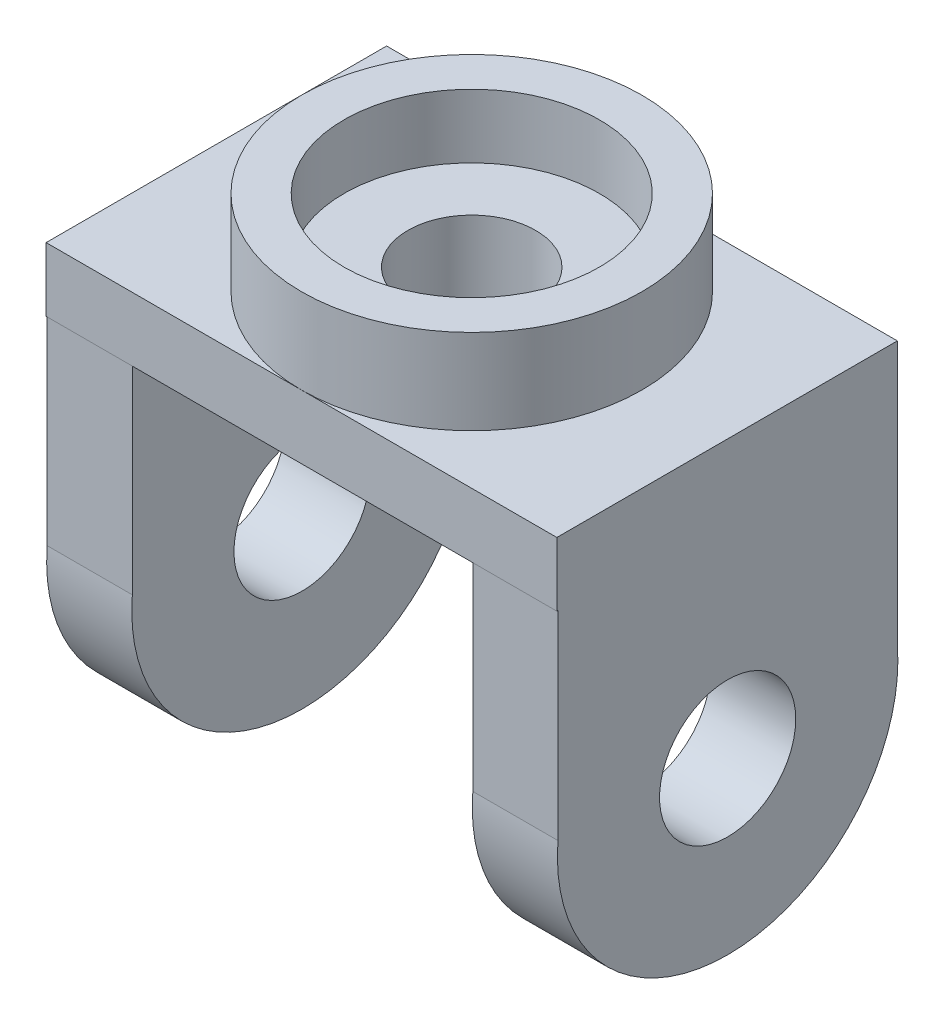
ISO-10303-21;
HEADER;
FILE_DESCRIPTION(('STEP AP214'),'2;1');
FILE_NAME('part.step','',(''),(''),'','','');
FILE_SCHEMA(('AUTOMOTIVE_DESIGN { 1 0 10303 214 1 1 1 1 }'));
ENDSEC;
DATA;
#1=APPLICATION_CONTEXT('core data for automotive mechanical design processes');
#2=APPLICATION_PROTOCOL_DEFINITION('international standard','automotive_design',2000,#1);
#3=PRODUCT_CONTEXT('',#1,'mechanical');
#4=PRODUCT('Part','Part','',(#3));
#5=PRODUCT_RELATED_PRODUCT_CATEGORY('part','',(#4));
#6=PRODUCT_DEFINITION_FORMATION('','',#4);
#7=PRODUCT_DEFINITION_CONTEXT('part definition',#1,'design');
#8=PRODUCT_DEFINITION('design','',#6,#7);
#9=PRODUCT_DEFINITION_SHAPE('','',#8);
#10=(LENGTH_UNIT() NAMED_UNIT(*) SI_UNIT(.MILLI.,.METRE.));
#11=(NAMED_UNIT(*) PLANE_ANGLE_UNIT() SI_UNIT($,.RADIAN.));
#12=(NAMED_UNIT(*) SI_UNIT($,.STERADIAN.) SOLID_ANGLE_UNIT());
#13=UNCERTAINTY_MEASURE_WITH_UNIT(LENGTH_MEASURE(1.E-05),#10,'distance_accuracy_value','');
#14=(GEOMETRIC_REPRESENTATION_CONTEXT(3) GLOBAL_UNCERTAINTY_ASSIGNED_CONTEXT((#13)) GLOBAL_UNIT_ASSIGNED_CONTEXT((#10,
#11,#12)) REPRESENTATION_CONTEXT('',''));
#15=CARTESIAN_POINT('',(0.,0.,0.));
#16=DIRECTION('',(0.,0.,1.));
#17=DIRECTION('',(1.,0.,0.));
#18=AXIS2_PLACEMENT_3D('',#15,#16,#17);
#19=CARTESIAN_POINT('',(0.,0.,0.));
#20=DIRECTION('',(0.,1.,0.));
#21=DIRECTION('',(0.,0.,1.));
#22=AXIS2_PLACEMENT_3D('',#19,#20,#21);
#23=PLANE('',#22);
#24=CARTESIAN_POINT('',(0.,0.,0.));
#25=DIRECTION('',(0.,1.,0.));
#26=DIRECTION('',(0.,0.,1.));
#27=AXIS2_PLACEMENT_3D('',#24,#25,#26);
#28=CIRCLE('',#27,15.);
#29=CARTESIAN_POINT('',(0.,0.,15.));
#30=VERTEX_POINT('',#29);
#31=EDGE_CURVE('E177',#30,#30,#28,.T.);
#32=ORIENTED_EDGE('',*,*,#31,.T.);
#33=EDGE_LOOP('',(#32));
#34=FACE_BOUND('',#33,.T.);
#35=DIRECTION('',(-1.,0.,0.));
#36=VECTOR('',#35,1.);
#37=CARTESIAN_POINT('',(-40.,0.,39.7439545187637));
#38=LINE('',#37,#36);
#39=CARTESIAN_POINT('',(-40.,0.,39.7439545187637));
#40=VERTEX_POINT('',#39);
#41=CARTESIAN_POINT('',(-60.,0.,39.7439545187637));
#42=VERTEX_POINT('',#41);
#43=EDGE_CURVE('E128',#40,#42,#38,.T.);
#44=ORIENTED_EDGE('',*,*,#43,.F.);
#45=DIRECTION('',(0.,0.,-1.));
#46=VECTOR('',#45,1.);
#47=CARTESIAN_POINT('',(-40.,0.,0.));
#48=LINE('',#47,#46);
#49=CARTESIAN_POINT('',(-40.,0.,-40.));
#50=VERTEX_POINT('',#49);
#51=EDGE_CURVE('E133',#40,#50,#48,.T.);
#52=ORIENTED_EDGE('',*,*,#51,.T.);
#53=DIRECTION('',(-1.,0.,0.));
#54=VECTOR('',#53,1.);
#55=CARTESIAN_POINT('',(-60.,0.,-40.));
#56=LINE('',#55,#54);
#57=CARTESIAN_POINT('',(40.,0.,-40.));
#58=VERTEX_POINT('',#57);
#59=EDGE_CURVE('E211',#58,#50,#56,.T.);
#60=ORIENTED_EDGE('',*,*,#59,.F.);
#61=DIRECTION('',(0.,0.,-1.));
#62=VECTOR('',#61,1.);
#63=CARTESIAN_POINT('',(40.,0.,0.));
#64=LINE('',#63,#62);
#65=CARTESIAN_POINT('',(40.,0.,39.7439545187637));
#66=VERTEX_POINT('',#65);
#67=EDGE_CURVE('E167',#66,#58,#64,.T.);
#68=ORIENTED_EDGE('',*,*,#67,.F.);
#69=DIRECTION('',(1.,0.,0.));
#70=VECTOR('',#69,1.);
#71=CARTESIAN_POINT('',(40.,0.,39.7439545187637));
#72=LINE('',#71,#70);
#73=CARTESIAN_POINT('',(60.,0.,39.7439545187637));
#74=VERTEX_POINT('',#73);
#75=EDGE_CURVE('E175',#66,#74,#72,.T.);
#76=ORIENTED_EDGE('',*,*,#75,.T.);
#77=DIRECTION('',(0.,0.,-1.));
#78=VECTOR('',#77,1.);
#79=CARTESIAN_POINT('',(60.,0.,-40.));
#80=LINE('',#79,#78);
#81=CARTESIAN_POINT('',(60.,0.,40.));
#82=VERTEX_POINT('',#81);
#83=EDGE_CURVE('E195',#82,#74,#80,.T.);
#84=ORIENTED_EDGE('',*,*,#83,.F.);
#85=DIRECTION('',(1.,0.,0.));
#86=VECTOR('',#85,1.);
#87=CARTESIAN_POINT('',(-60.,0.,40.));
#88=LINE('',#87,#86);
#89=CARTESIAN_POINT('',(-60.,0.,40.));
#90=VERTEX_POINT('',#89);
#91=EDGE_CURVE('E200',#90,#82,#88,.T.);
#92=ORIENTED_EDGE('',*,*,#91,.F.);
#93=DIRECTION('',(0.,0.,1.));
#94=VECTOR('',#93,1.);
#95=CARTESIAN_POINT('',(-60.,0.,-40.));
#96=LINE('',#95,#94);
#97=EDGE_CURVE('E145',#42,#90,#96,.T.);
#98=ORIENTED_EDGE('',*,*,#97,.F.);
#99=EDGE_LOOP('',(#44,#52,#60,#68,#76,#84,#92,#98));
#100=FACE_BOUND('',#99,.T.);
#101=ADVANCED_FACE('F39',(#34,#100),#23,.F.);
#102=CARTESIAN_POINT('',(0.,15.,0.));
#103=DIRECTION('',(0.,1.,0.));
#104=DIRECTION('',(0.,0.,1.));
#105=AXIS2_PLACEMENT_3D('',#102,#103,#104);
#106=PLANE('',#105);
#107=CARTESIAN_POINT('',(0.,15.,0.));
#108=DIRECTION('',(0.,1.,0.));
#109=DIRECTION('',(0.,0.,1.));
#110=AXIS2_PLACEMENT_3D('',#107,#108,#109);
#111=CIRCLE('',#110,40.);
#112=CARTESIAN_POINT('',(0.,15.,40.));
#113=VERTEX_POINT('',#112);
#114=CARTESIAN_POINT('',(0.,15.,-40.));
#115=VERTEX_POINT('',#114);
#116=EDGE_CURVE('E49',#113,#115,#111,.T.);
#117=ORIENTED_EDGE('',*,*,#116,.F.);
#118=DIRECTION('',(1.,0.,0.));
#119=VECTOR('',#118,1.);
#120=CARTESIAN_POINT('',(-60.,15.,40.));
#121=LINE('',#120,#119);
#122=CARTESIAN_POINT('',(60.,15.,40.));
#123=VERTEX_POINT('',#122);
#124=EDGE_CURVE('E202',#113,#123,#121,.T.);
#125=ORIENTED_EDGE('',*,*,#124,.T.);
#126=DIRECTION('',(0.,0.,-1.));
#127=VECTOR('',#126,1.);
#128=CARTESIAN_POINT('',(60.,15.,-40.));
#129=LINE('',#128,#127);
#130=CARTESIAN_POINT('',(60.,15.,-40.));
#131=VERTEX_POINT('',#130);
#132=EDGE_CURVE('E194',#123,#131,#129,.T.);
#133=ORIENTED_EDGE('',*,*,#132,.T.);
#134=DIRECTION('',(-1.,0.,0.));
#135=VECTOR('',#134,1.);
#136=CARTESIAN_POINT('',(-60.,15.,-40.));
#137=LINE('',#136,#135);
#138=EDGE_CURVE('E199',#131,#115,#137,.T.);
#139=ORIENTED_EDGE('',*,*,#138,.T.);
#140=EDGE_LOOP('',(#117,#125,#133,#139));
#141=FACE_BOUND('',#140,.T.);
#142=ADVANCED_FACE('F241',(#141),#106,.T.);
#143=CARTESIAN_POINT('',(60.,15.,-40.));
#144=DIRECTION('',(-1.,0.,0.));
#145=DIRECTION('',(0.,0.,1.));
#146=AXIS2_PLACEMENT_3D('',#143,#144,#145);
#147=PLANE('',#146);
#148=CARTESIAN_POINT('',(60.,-50.,-0.128022740618162));
#149=DIRECTION('',(1.,0.,0.));
#150=DIRECTION('',(0.,0.,-1.));
#151=AXIS2_PLACEMENT_3D('',#148,#149,#150);
#152=CIRCLE('',#151,16.);
#153=CARTESIAN_POINT('',(60.,-50.,-16.1280227406182));
#154=VERTEX_POINT('',#153);
#155=EDGE_CURVE('E153',#154,#154,#152,.T.);
#156=ORIENTED_EDGE('',*,*,#155,.F.);
#157=EDGE_LOOP('',(#156));
#158=FACE_BOUND('',#157,.T.);
#159=ORIENTED_EDGE('',*,*,#83,.T.);
#160=DIRECTION('',(0.,-1.,0.));
#161=VECTOR('',#160,1.);
#162=CARTESIAN_POINT('',(60.,0.,39.7439545187637));
#163=LINE('',#162,#161);
#164=CARTESIAN_POINT('',(60.,-46.8022774624215,39.7439545187637));
#165=VERTEX_POINT('',#164);
#166=EDGE_CURVE('E64',#74,#165,#163,.T.);
#167=ORIENTED_EDGE('',*,*,#166,.T.);
#168=CARTESIAN_POINT('',(60.,-50.,-0.128022740618162));
#169=DIRECTION('',(1.,0.,0.));
#170=DIRECTION('',(0.,0.,-1.));
#171=AXIS2_PLACEMENT_3D('',#168,#169,#170);
#172=CIRCLE('',#171,40.);
#173=CARTESIAN_POINT('',(60.,-46.8022774624215,-40.));
#174=VERTEX_POINT('',#173);
#175=EDGE_CURVE('E161',#165,#174,#172,.T.);
#176=ORIENTED_EDGE('',*,*,#175,.T.);
#177=DIRECTION('',(0.,-1.,0.));
#178=VECTOR('',#177,1.);
#179=CARTESIAN_POINT('',(60.,15.,-40.));
#180=LINE('',#179,#178);
#181=EDGE_CURVE('E48',#131,#174,#180,.T.);
#182=ORIENTED_EDGE('',*,*,#181,.F.);
#183=ORIENTED_EDGE('',*,*,#132,.F.);
#184=DIRECTION('',(0.,-1.,0.));
#185=VECTOR('',#184,1.);
#186=CARTESIAN_POINT('',(60.,15.,40.));
#187=LINE('',#186,#185);
#188=EDGE_CURVE('E208',#123,#82,#187,.T.);
#189=ORIENTED_EDGE('',*,*,#188,.T.);
#190=EDGE_LOOP('',(#159,#167,#176,#182,#183,#189));
#191=FACE_BOUND('',#190,.T.);
#192=ADVANCED_FACE('F41',(#158,#191),#147,.F.);
#193=CARTESIAN_POINT('',(-60.,15.,-40.));
#194=DIRECTION('',(0.,0.,1.));
#195=DIRECTION('',(1.,0.,0.));
#196=AXIS2_PLACEMENT_3D('',#193,#194,#195);
#197=PLANE('',#196);
#198=ORIENTED_EDGE('',*,*,#181,.T.);
#199=DIRECTION('',(1.,0.,0.));
#200=VECTOR('',#199,1.);
#201=CARTESIAN_POINT('',(40.,-46.8022774624215,-40.));
#202=LINE('',#201,#200);
#203=CARTESIAN_POINT('',(40.,-46.8022774624215,-40.));
#204=VERTEX_POINT('',#203);
#205=EDGE_CURVE('E174',#204,#174,#202,.T.);
#206=ORIENTED_EDGE('',*,*,#205,.F.);
#207=DIRECTION('',(0.,-1.,0.));
#208=VECTOR('',#207,1.);
#209=CARTESIAN_POINT('',(40.,0.,-40.));
#210=LINE('',#209,#208);
#211=EDGE_CURVE('E163',#58,#204,#210,.T.);
#212=ORIENTED_EDGE('',*,*,#211,.F.);
#213=ORIENTED_EDGE('',*,*,#59,.T.);
#214=DIRECTION('',(0.,-1.,0.));
#215=VECTOR('',#214,1.);
#216=CARTESIAN_POINT('',(-40.,0.,-40.));
#217=LINE('',#216,#215);
#218=CARTESIAN_POINT('',(-40.,-46.8022774624215,-40.));
#219=VERTEX_POINT('',#218);
#220=EDGE_CURVE('E60',#50,#219,#217,.T.);
#221=ORIENTED_EDGE('',*,*,#220,.T.);
#222=DIRECTION('',(-1.,0.,0.));
#223=VECTOR('',#222,1.);
#224=CARTESIAN_POINT('',(-40.,-46.8022774624215,-40.));
#225=LINE('',#224,#223);
#226=CARTESIAN_POINT('',(-60.,-46.8022774624215,-40.));
#227=VERTEX_POINT('',#226);
#228=EDGE_CURVE('E144',#219,#227,#225,.T.);
#229=ORIENTED_EDGE('',*,*,#228,.T.);
#230=DIRECTION('',(0.,-1.,0.));
#231=VECTOR('',#230,1.);
#232=CARTESIAN_POINT('',(-60.,15.,-40.));
#233=LINE('',#232,#231);
#234=CARTESIAN_POINT('',(-60.,15.,-40.));
#235=VERTEX_POINT('',#234);
#236=EDGE_CURVE('E219',#235,#227,#233,.T.);
#237=ORIENTED_EDGE('',*,*,#236,.F.);
#238=EDGE_CURVE('E196',#115,#235,#137,.T.);
#239=ORIENTED_EDGE('',*,*,#238,.F.);
#240=ORIENTED_EDGE('',*,*,#138,.F.);
#241=EDGE_LOOP('',(#198,#206,#212,#213,#221,#229,#237,#239,#240));
#242=FACE_BOUND('',#241,.T.);
#243=ADVANCED_FACE('F259',(#242),#197,.F.);
#244=CARTESIAN_POINT('',(-60.,15.,-40.));
#245=DIRECTION('',(1.,0.,0.));
#246=DIRECTION('',(0.,0.,-1.));
#247=AXIS2_PLACEMENT_3D('',#244,#245,#246);
#248=PLANE('',#247);
#249=CARTESIAN_POINT('',(-60.,-50.,-0.128022740618162));
#250=DIRECTION('',(1.,0.,0.));
#251=DIRECTION('',(0.,0.,-1.));
#252=AXIS2_PLACEMENT_3D('',#249,#250,#251);
#253=CIRCLE('',#252,16.);
#254=CARTESIAN_POINT('',(-60.,-50.,-16.1280227406182));
#255=VERTEX_POINT('',#254);
#256=EDGE_CURVE('E409',#255,#255,#253,.T.);
#257=ORIENTED_EDGE('',*,*,#256,.T.);
#258=EDGE_LOOP('',(#257));
#259=FACE_BOUND('',#258,.T.);
#260=ORIENTED_EDGE('',*,*,#236,.T.);
#261=CARTESIAN_POINT('',(-60.,-50.,-0.128022740618162));
#262=DIRECTION('',(1.,0.,0.));
#263=DIRECTION('',(0.,0.,-1.));
#264=AXIS2_PLACEMENT_3D('',#261,#262,#263);
#265=CIRCLE('',#264,40.);
#266=CARTESIAN_POINT('',(-60.,-46.8022774624215,39.7439545187637));
#267=VERTEX_POINT('',#266);
#268=EDGE_CURVE('E134',#267,#227,#265,.T.);
#269=ORIENTED_EDGE('',*,*,#268,.F.);
#270=DIRECTION('',(0.,-1.,0.));
#271=VECTOR('',#270,1.);
#272=CARTESIAN_POINT('',(-60.,0.,39.7439545187637));
#273=LINE('',#272,#271);
#274=EDGE_CURVE('E284',#42,#267,#273,.T.);
#275=ORIENTED_EDGE('',*,*,#274,.F.);
#276=ORIENTED_EDGE('',*,*,#97,.T.);
#277=DIRECTION('',(0.,-1.,0.));
#278=VECTOR('',#277,1.);
#279=CARTESIAN_POINT('',(-60.,15.,40.));
#280=LINE('',#279,#278);
#281=CARTESIAN_POINT('',(-60.,15.,40.));
#282=VERTEX_POINT('',#281);
#283=EDGE_CURVE('E220',#282,#90,#280,.T.);
#284=ORIENTED_EDGE('',*,*,#283,.F.);
#285=DIRECTION('',(0.,0.,1.));
#286=VECTOR('',#285,1.);
#287=CARTESIAN_POINT('',(-60.,15.,-40.));
#288=LINE('',#287,#286);
#289=EDGE_CURVE('E201',#235,#282,#288,.T.);
#290=ORIENTED_EDGE('',*,*,#289,.F.);
#291=EDGE_LOOP('',(#260,#269,#275,#276,#284,#290));
#292=FACE_BOUND('',#291,.T.);
#293=ADVANCED_FACE('F258',(#259,#292),#248,.F.);
#294=CARTESIAN_POINT('',(-60.,15.,40.));
#295=DIRECTION('',(0.,0.,-1.));
#296=DIRECTION('',(-1.,0.,0.));
#297=AXIS2_PLACEMENT_3D('',#294,#295,#296);
#298=PLANE('',#297);
#299=ORIENTED_EDGE('',*,*,#91,.T.);
#300=ORIENTED_EDGE('',*,*,#188,.F.);
#301=ORIENTED_EDGE('',*,*,#124,.F.);
#302=EDGE_CURVE('E206',#282,#113,#121,.T.);
#303=ORIENTED_EDGE('',*,*,#302,.F.);
#304=ORIENTED_EDGE('',*,*,#283,.T.);
#305=EDGE_LOOP('',(#299,#300,#301,#303,#304));
#306=FACE_BOUND('',#305,.T.);
#307=ADVANCED_FACE('F251',(#306),#298,.F.);
#308=EDGE_CURVE('E11',#115,#113,#111,.T.);
#309=ORIENTED_EDGE('',*,*,#308,.F.);
#310=ORIENTED_EDGE('',*,*,#238,.T.);
#311=ORIENTED_EDGE('',*,*,#289,.T.);
#312=ORIENTED_EDGE('',*,*,#302,.T.);
#313=EDGE_LOOP('',(#309,#310,#311,#312));
#314=FACE_BOUND('',#313,.T.);
#315=ADVANCED_FACE('F249',(#314),#106,.T.);
#316=CARTESIAN_POINT('',(0.,35.,0.));
#317=DIRECTION('',(0.,-1.,0.));
#318=DIRECTION('',(0.,0.,-1.));
#319=AXIS2_PLACEMENT_3D('',#316,#317,#318);
#320=CYLINDRICAL_SURFACE('',#319,40.);
#321=CARTESIAN_POINT('',(0.,35.,0.));
#322=DIRECTION('',(0.,1.,0.));
#323=DIRECTION('',(0.,0.,1.));
#324=AXIS2_PLACEMENT_3D('',#321,#322,#323);
#325=CIRCLE('',#324,40.);
#326=CARTESIAN_POINT('',(0.,35.,40.));
#327=VERTEX_POINT('',#326);
#328=EDGE_CURVE('E189',#327,#327,#325,.T.);
#329=ORIENTED_EDGE('',*,*,#328,.F.);
#330=EDGE_LOOP('',(#329));
#331=FACE_BOUND('',#330,.T.);
#332=ORIENTED_EDGE('',*,*,#116,.T.);
#333=ORIENTED_EDGE('',*,*,#308,.T.);
#334=EDGE_LOOP('',(#332,#333));
#335=FACE_BOUND('',#334,.T.);
#336=ADVANCED_FACE('F294',(#331,#335),#320,.T.);
#337=CARTESIAN_POINT('',(0.,35.,0.));
#338=DIRECTION('',(0.,1.,0.));
#339=DIRECTION('',(0.,0.,1.));
#340=AXIS2_PLACEMENT_3D('',#337,#338,#339);
#341=PLANE('',#340);
#342=CARTESIAN_POINT('',(0.,35.,0.));
#343=DIRECTION('',(0.,1.,0.));
#344=DIRECTION('',(0.,0.,1.));
#345=AXIS2_PLACEMENT_3D('',#342,#343,#344);
#346=CIRCLE('',#345,30.);
#347=CARTESIAN_POINT('',(0.,35.,30.));
#348=VERTEX_POINT('',#347);
#349=EDGE_CURVE('E185',#348,#348,#346,.T.);
#350=ORIENTED_EDGE('',*,*,#349,.F.);
#351=EDGE_LOOP('',(#350));
#352=FACE_BOUND('',#351,.T.);
#353=ORIENTED_EDGE('',*,*,#328,.T.);
#354=EDGE_LOOP('',(#353));
#355=FACE_BOUND('',#354,.T.);
#356=ADVANCED_FACE('F303',(#352,#355),#341,.T.);
#357=CARTESIAN_POINT('',(0.,20.,0.));
#358=DIRECTION('',(0.,1.,0.));
#359=DIRECTION('',(0.,0.,1.));
#360=AXIS2_PLACEMENT_3D('',#357,#358,#359);
#361=CYLINDRICAL_SURFACE('',#360,30.);
#362=CARTESIAN_POINT('',(0.,20.,0.));
#363=DIRECTION('',(0.,1.,0.));
#364=DIRECTION('',(0.,0.,1.));
#365=AXIS2_PLACEMENT_3D('',#362,#363,#364);
#366=CIRCLE('',#365,30.);
#367=CARTESIAN_POINT('',(0.,20.,30.));
#368=VERTEX_POINT('',#367);
#369=EDGE_CURVE('E183',#368,#368,#366,.T.);
#370=ORIENTED_EDGE('',*,*,#369,.F.);
#371=EDGE_LOOP('',(#370));
#372=FACE_BOUND('',#371,.T.);
#373=ORIENTED_EDGE('',*,*,#349,.T.);
#374=EDGE_LOOP('',(#373));
#375=FACE_BOUND('',#374,.T.);
#376=ADVANCED_FACE('F308',(#372,#375),#361,.F.);
#377=CARTESIAN_POINT('',(0.,20.,0.));
#378=DIRECTION('',(0.,1.,0.));
#379=DIRECTION('',(0.,0.,1.));
#380=AXIS2_PLACEMENT_3D('',#377,#378,#379);
#381=PLANE('',#380);
#382=CARTESIAN_POINT('',(0.,20.,0.));
#383=DIRECTION('',(0.,1.,0.));
#384=DIRECTION('',(0.,0.,1.));
#385=AXIS2_PLACEMENT_3D('',#382,#383,#384);
#386=CIRCLE('',#385,15.);
#387=CARTESIAN_POINT('',(0.,20.,15.));
#388=VERTEX_POINT('',#387);
#389=EDGE_CURVE('E173',#388,#388,#386,.T.);
#390=ORIENTED_EDGE('',*,*,#389,.F.);
#391=EDGE_LOOP('',(#390));
#392=FACE_BOUND('',#391,.T.);
#393=ORIENTED_EDGE('',*,*,#369,.T.);
#394=EDGE_LOOP('',(#393));
#395=FACE_BOUND('',#394,.T.);
#396=ADVANCED_FACE('F311',(#392,#395),#381,.T.);
#397=CARTESIAN_POINT('',(0.,0.,0.));
#398=DIRECTION('',(0.,1.,0.));
#399=DIRECTION('',(0.,0.,1.));
#400=AXIS2_PLACEMENT_3D('',#397,#398,#399);
#401=CYLINDRICAL_SURFACE('',#400,15.);
#402=ORIENTED_EDGE('',*,*,#31,.F.);
#403=EDGE_LOOP('',(#402));
#404=FACE_BOUND('',#403,.T.);
#405=ORIENTED_EDGE('',*,*,#389,.T.);
#406=EDGE_LOOP('',(#405));
#407=FACE_BOUND('',#406,.T.);
#408=ADVANCED_FACE('F320',(#404,#407),#401,.F.);
#409=CARTESIAN_POINT('',(40.,0.,39.7439545187637));
#410=DIRECTION('',(0.,0.,1.));
#411=DIRECTION('',(0.,-1.,0.));
#412=AXIS2_PLACEMENT_3D('',#409,#410,#411);
#413=PLANE('',#412);
#414=ORIENTED_EDGE('',*,*,#166,.F.);
#415=ORIENTED_EDGE('',*,*,#75,.F.);
#416=DIRECTION('',(0.,-1.,0.));
#417=VECTOR('',#416,1.);
#418=CARTESIAN_POINT('',(40.,0.,39.7439545187637));
#419=LINE('',#418,#417);
#420=CARTESIAN_POINT('',(40.,-46.8022774624215,39.7439545187637));
#421=VERTEX_POINT('',#420);
#422=EDGE_CURVE('E160',#66,#421,#419,.T.);
#423=ORIENTED_EDGE('',*,*,#422,.T.);
#424=DIRECTION('',(1.,0.,0.));
#425=VECTOR('',#424,1.);
#426=CARTESIAN_POINT('',(40.,-46.8022774624215,39.7439545187637));
#427=LINE('',#426,#425);
#428=EDGE_CURVE('E169',#421,#165,#427,.T.);
#429=ORIENTED_EDGE('',*,*,#428,.T.);
#430=EDGE_LOOP('',(#414,#415,#423,#429));
#431=FACE_BOUND('',#430,.T.);
#432=ADVANCED_FACE('F276',(#431),#413,.T.);
#433=CARTESIAN_POINT('',(40.,-50.,-0.128022740618162));
#434=DIRECTION('',(1.,0.,0.));
#435=DIRECTION('',(0.,0.,-1.));
#436=AXIS2_PLACEMENT_3D('',#433,#434,#435);
#437=CYLINDRICAL_SURFACE('',#436,40.);
#438=ORIENTED_EDGE('',*,*,#175,.F.);
#439=ORIENTED_EDGE('',*,*,#428,.F.);
#440=CARTESIAN_POINT('',(40.,-50.,-0.128022740618162));
#441=DIRECTION('',(1.,0.,0.));
#442=DIRECTION('',(0.,0.,-1.));
#443=AXIS2_PLACEMENT_3D('',#440,#441,#442);
#444=CIRCLE('',#443,40.);
#445=EDGE_CURVE('E159',#421,#204,#444,.T.);
#446=ORIENTED_EDGE('',*,*,#445,.T.);
#447=ORIENTED_EDGE('',*,*,#205,.T.);
#448=EDGE_LOOP('',(#438,#439,#446,#447));
#449=FACE_BOUND('',#448,.T.);
#450=ADVANCED_FACE('F239',(#449),#437,.T.);
#451=CARTESIAN_POINT('',(40.,0.,0.));
#452=DIRECTION('',(1.,0.,0.));
#453=DIRECTION('',(0.,0.,-1.));
#454=AXIS2_PLACEMENT_3D('',#451,#452,#453);
#455=PLANE('',#454);
#456=CARTESIAN_POINT('',(40.,-50.,-0.128022740618162));
#457=DIRECTION('',(1.,0.,0.));
#458=DIRECTION('',(0.,0.,-1.));
#459=AXIS2_PLACEMENT_3D('',#456,#457,#458);
#460=CIRCLE('',#459,16.);
#461=CARTESIAN_POINT('',(40.,-50.,-16.1280227406182));
#462=VERTEX_POINT('',#461);
#463=EDGE_CURVE('E156',#462,#462,#460,.T.);
#464=ORIENTED_EDGE('',*,*,#463,.T.);
#465=EDGE_LOOP('',(#464));
#466=FACE_BOUND('',#465,.T.);
#467=ORIENTED_EDGE('',*,*,#422,.F.);
#468=ORIENTED_EDGE('',*,*,#67,.T.);
#469=ORIENTED_EDGE('',*,*,#211,.T.);
#470=ORIENTED_EDGE('',*,*,#445,.F.);
#471=EDGE_LOOP('',(#467,#468,#469,#470));
#472=FACE_BOUND('',#471,.T.);
#473=ADVANCED_FACE('F223',(#466,#472),#455,.F.);
#474=CARTESIAN_POINT('',(-60.,-50.,-0.128022740618162));
#475=DIRECTION('',(1.,0.,0.));
#476=DIRECTION('',(0.,0.,-1.));
#477=AXIS2_PLACEMENT_3D('',#474,#475,#476);
#478=CYLINDRICAL_SURFACE('',#477,16.);
#479=ORIENTED_EDGE('',*,*,#155,.T.);
#480=EDGE_LOOP('',(#479));
#481=FACE_BOUND('',#480,.T.);
#482=ORIENTED_EDGE('',*,*,#463,.F.);
#483=EDGE_LOOP('',(#482));
#484=FACE_BOUND('',#483,.T.);
#485=ADVANCED_FACE('F227',(#481,#484),#478,.F.);
#486=CARTESIAN_POINT('',(-40.,0.,39.7439545187637));
#487=DIRECTION('',(0.,0.,-1.));
#488=DIRECTION('',(0.,1.,0.));
#489=AXIS2_PLACEMENT_3D('',#486,#487,#488);
#490=PLANE('',#489);
#491=ORIENTED_EDGE('',*,*,#274,.T.);
#492=DIRECTION('',(-1.,0.,0.));
#493=VECTOR('',#492,1.);
#494=CARTESIAN_POINT('',(-40.,-46.8022774624215,39.7439545187637));
#495=LINE('',#494,#493);
#496=CARTESIAN_POINT('',(-40.,-46.8022774624215,39.7439545187637));
#497=VERTEX_POINT('',#496);
#498=EDGE_CURVE('E132',#497,#267,#495,.T.);
#499=ORIENTED_EDGE('',*,*,#498,.F.);
#500=DIRECTION('',(0.,-1.,0.));
#501=VECTOR('',#500,1.);
#502=CARTESIAN_POINT('',(-40.,0.,39.7439545187637));
#503=LINE('',#502,#501);
#504=EDGE_CURVE('E127',#40,#497,#503,.T.);
#505=ORIENTED_EDGE('',*,*,#504,.F.);
#506=ORIENTED_EDGE('',*,*,#43,.T.);
#507=EDGE_LOOP('',(#491,#499,#505,#506));
#508=FACE_BOUND('',#507,.T.);
#509=ADVANCED_FACE('F126',(#508),#490,.F.);
#510=CARTESIAN_POINT('',(-40.,-50.,-0.128022740618162));
#511=DIRECTION('',(-1.,0.,0.));
#512=DIRECTION('',(0.,0.,1.));
#513=AXIS2_PLACEMENT_3D('',#510,#511,#512);
#514=CYLINDRICAL_SURFACE('',#513,40.);
#515=ORIENTED_EDGE('',*,*,#268,.T.);
#516=ORIENTED_EDGE('',*,*,#228,.F.);
#517=CARTESIAN_POINT('',(-40.,-50.,-0.128022740618162));
#518=DIRECTION('',(1.,0.,0.));
#519=DIRECTION('',(0.,0.,-1.));
#520=AXIS2_PLACEMENT_3D('',#517,#518,#519);
#521=CIRCLE('',#520,40.);
#522=EDGE_CURVE('E148',#497,#219,#521,.T.);
#523=ORIENTED_EDGE('',*,*,#522,.F.);
#524=ORIENTED_EDGE('',*,*,#498,.T.);
#525=EDGE_LOOP('',(#515,#516,#523,#524));
#526=FACE_BOUND('',#525,.T.);
#527=ADVANCED_FACE('F240',(#526),#514,.T.);
#528=CARTESIAN_POINT('',(-40.,0.,0.));
#529=DIRECTION('',(-1.,0.,0.));
#530=DIRECTION('',(0.,0.,-1.));
#531=AXIS2_PLACEMENT_3D('',#528,#529,#530);
#532=PLANE('',#531);
#533=CARTESIAN_POINT('',(-40.,-50.,-0.128022740618162));
#534=DIRECTION('',(-1.,0.,0.));
#535=DIRECTION('',(0.,0.,1.));
#536=AXIS2_PLACEMENT_3D('',#533,#534,#535);
#537=CIRCLE('',#536,16.);
#538=CARTESIAN_POINT('',(-40.,-50.,15.8719772593818));
#539=VERTEX_POINT('',#538);
#540=EDGE_CURVE('E43',#539,#539,#537,.F.);
#541=ORIENTED_EDGE('',*,*,#540,.F.);
#542=EDGE_LOOP('',(#541));
#543=FACE_BOUND('',#542,.T.);
#544=ORIENTED_EDGE('',*,*,#504,.T.);
#545=ORIENTED_EDGE('',*,*,#522,.T.);
#546=ORIENTED_EDGE('',*,*,#220,.F.);
#547=ORIENTED_EDGE('',*,*,#51,.F.);
#548=EDGE_LOOP('',(#544,#545,#546,#547));
#549=FACE_BOUND('',#548,.T.);
#550=ADVANCED_FACE('F140',(#543,#549),#532,.F.);
#551=CARTESIAN_POINT('',(60.,-50.,-0.128022740618162));
#552=DIRECTION('',(-1.,0.,0.));
#553=DIRECTION('',(0.,0.,1.));
#554=AXIS2_PLACEMENT_3D('',#551,#552,#553);
#555=CYLINDRICAL_SURFACE('',#554,16.);
#556=ORIENTED_EDGE('',*,*,#256,.F.);
#557=EDGE_LOOP('',(#556));
#558=FACE_BOUND('',#557,.T.);
#559=ORIENTED_EDGE('',*,*,#540,.T.);
#560=EDGE_LOOP('',(#559));
#561=FACE_BOUND('',#560,.T.);
#562=ADVANCED_FACE('F391',(#558,#561),#555,.F.);
#563=CLOSED_SHELL('',(#101,#142,#192,#243,#293,#307,#315,#336,#356,#376,#396,#408,#432,#450,
#473,#485,#509,#527,#550,#562));
#564=MANIFOLD_SOLID_BREP('B2',#563);
#565=ADVANCED_BREP_SHAPE_REPRESENTATION('',(#18,#564),#14);
#566=SHAPE_DEFINITION_REPRESENTATION(#9,#565);
ENDSEC;
END-ISO-10303-21;
